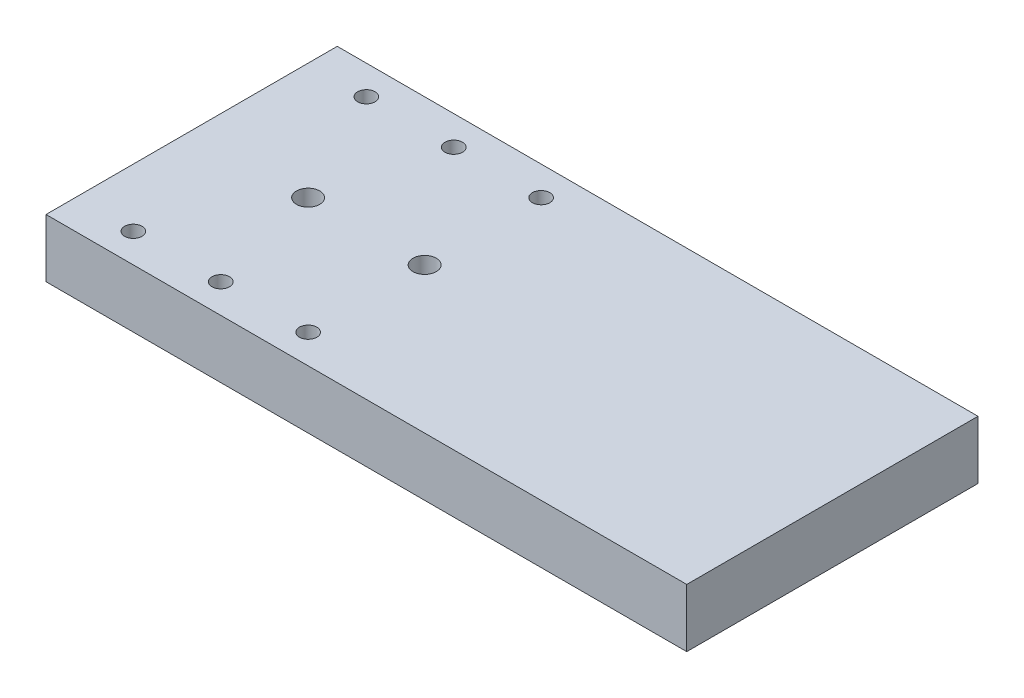
ISO-10303-21;
HEADER;
FILE_DESCRIPTION(('STEP AP214'),'2;1');
FILE_NAME('part.step','',(''),(''),'','','');
FILE_SCHEMA(('AUTOMOTIVE_DESIGN { 1 0 10303 214 1 1 1 1 }'));
ENDSEC;
DATA;
#1=APPLICATION_CONTEXT('core data for automotive mechanical design processes');
#2=APPLICATION_PROTOCOL_DEFINITION('international standard','automotive_design',2000,#1);
#3=PRODUCT_CONTEXT('',#1,'mechanical');
#4=PRODUCT('Part','Part','',(#3));
#5=PRODUCT_RELATED_PRODUCT_CATEGORY('part','',(#4));
#6=PRODUCT_DEFINITION_FORMATION('','',#4);
#7=PRODUCT_DEFINITION_CONTEXT('part definition',#1,'design');
#8=PRODUCT_DEFINITION('design','',#6,#7);
#9=PRODUCT_DEFINITION_SHAPE('','',#8);
#10=(LENGTH_UNIT() NAMED_UNIT(*) SI_UNIT(.MILLI.,.METRE.));
#11=(NAMED_UNIT(*) PLANE_ANGLE_UNIT() SI_UNIT($,.RADIAN.));
#12=(NAMED_UNIT(*) SI_UNIT($,.STERADIAN.) SOLID_ANGLE_UNIT());
#13=UNCERTAINTY_MEASURE_WITH_UNIT(LENGTH_MEASURE(1.E-05),#10,'distance_accuracy_value','');
#14=(GEOMETRIC_REPRESENTATION_CONTEXT(3) GLOBAL_UNCERTAINTY_ASSIGNED_CONTEXT((#13)) GLOBAL_UNIT_ASSIGNED_CONTEXT((#10,
#11,#12)) REPRESENTATION_CONTEXT('',''));
#15=CARTESIAN_POINT('',(0.,0.,0.));
#16=DIRECTION('',(0.,0.,1.));
#17=DIRECTION('',(1.,0.,0.));
#18=AXIS2_PLACEMENT_3D('',#15,#16,#17);
#19=CARTESIAN_POINT('',(0.,20.,0.));
#20=DIRECTION('',(1.,0.,0.));
#21=DIRECTION('',(0.,0.,-1.));
#22=AXIS2_PLACEMENT_3D('',#19,#20,#21);
#23=PLANE('',#22);
#24=DIRECTION('',(0.,0.,1.));
#25=VECTOR('',#24,1.);
#26=CARTESIAN_POINT('',(0.,0.,0.));
#27=LINE('',#26,#25);
#28=CARTESIAN_POINT('',(0.,0.,-100.));
#29=VERTEX_POINT('',#28);
#30=CARTESIAN_POINT('',(0.,0.,0.));
#31=VERTEX_POINT('',#30);
#32=EDGE_CURVE('E97',#29,#31,#27,.T.);
#33=ORIENTED_EDGE('',*,*,#32,.T.);
#34=DIRECTION('',(0.,-1.,0.));
#35=VECTOR('',#34,1.);
#36=CARTESIAN_POINT('',(0.,20.,0.));
#37=LINE('',#36,#35);
#38=CARTESIAN_POINT('',(0.,20.,0.));
#39=VERTEX_POINT('',#38);
#40=EDGE_CURVE('E11',#39,#31,#37,.T.);
#41=ORIENTED_EDGE('',*,*,#40,.F.);
#42=DIRECTION('',(0.,0.,1.));
#43=VECTOR('',#42,1.);
#44=CARTESIAN_POINT('',(0.,20.,0.));
#45=LINE('',#44,#43);
#46=CARTESIAN_POINT('',(0.,20.,-100.));
#47=VERTEX_POINT('',#46);
#48=EDGE_CURVE('E85',#47,#39,#45,.T.);
#49=ORIENTED_EDGE('',*,*,#48,.F.);
#50=DIRECTION('',(0.,-1.,0.));
#51=VECTOR('',#50,1.);
#52=CARTESIAN_POINT('',(0.,20.,-100.));
#53=LINE('',#52,#51);
#54=EDGE_CURVE('E93',#47,#29,#53,.T.);
#55=ORIENTED_EDGE('',*,*,#54,.T.);
#56=EDGE_LOOP('',(#33,#41,#49,#55));
#57=FACE_BOUND('',#56,.T.);
#58=ADVANCED_FACE('F34',(#57),#23,.F.);
#59=CARTESIAN_POINT('',(0.,20.,0.));
#60=DIRECTION('',(0.,0.,-1.));
#61=DIRECTION('',(-1.,0.,0.));
#62=AXIS2_PLACEMENT_3D('',#59,#60,#61);
#63=PLANE('',#62);
#64=DIRECTION('',(1.,0.,0.));
#65=VECTOR('',#64,1.);
#66=CARTESIAN_POINT('',(0.,0.,0.));
#67=LINE('',#66,#65);
#68=CARTESIAN_POINT('',(220.,0.,0.));
#69=VERTEX_POINT('',#68);
#70=EDGE_CURVE('E89',#31,#69,#67,.T.);
#71=ORIENTED_EDGE('',*,*,#70,.T.);
#72=DIRECTION('',(0.,-1.,0.));
#73=VECTOR('',#72,1.);
#74=CARTESIAN_POINT('',(220.,20.,0.));
#75=LINE('',#74,#73);
#76=CARTESIAN_POINT('',(220.,20.,0.));
#77=VERTEX_POINT('',#76);
#78=EDGE_CURVE('E42',#77,#69,#75,.T.);
#79=ORIENTED_EDGE('',*,*,#78,.F.);
#80=DIRECTION('',(1.,0.,0.));
#81=VECTOR('',#80,1.);
#82=CARTESIAN_POINT('',(0.,20.,0.));
#83=LINE('',#82,#81);
#84=EDGE_CURVE('E80',#39,#77,#83,.T.);
#85=ORIENTED_EDGE('',*,*,#84,.F.);
#86=ORIENTED_EDGE('',*,*,#40,.T.);
#87=EDGE_LOOP('',(#71,#79,#85,#86));
#88=FACE_BOUND('',#87,.T.);
#89=ADVANCED_FACE('F88',(#88),#63,.F.);
#90=CARTESIAN_POINT('',(220.,20.,0.));
#91=DIRECTION('',(-1.,0.,0.));
#92=DIRECTION('',(0.,0.,1.));
#93=AXIS2_PLACEMENT_3D('',#90,#91,#92);
#94=PLANE('',#93);
#95=DIRECTION('',(0.,0.,-1.));
#96=VECTOR('',#95,1.);
#97=CARTESIAN_POINT('',(220.,0.,0.));
#98=LINE('',#97,#96);
#99=CARTESIAN_POINT('',(220.,0.,-100.));
#100=VERTEX_POINT('',#99);
#101=EDGE_CURVE('E67',#69,#100,#98,.T.);
#102=ORIENTED_EDGE('',*,*,#101,.T.);
#103=DIRECTION('',(0.,-1.,0.));
#104=VECTOR('',#103,1.);
#105=CARTESIAN_POINT('',(220.,20.,-100.));
#106=LINE('',#105,#104);
#107=CARTESIAN_POINT('',(220.,20.,-100.));
#108=VERTEX_POINT('',#107);
#109=EDGE_CURVE('E90',#108,#100,#106,.T.);
#110=ORIENTED_EDGE('',*,*,#109,.F.);
#111=DIRECTION('',(0.,0.,-1.));
#112=VECTOR('',#111,1.);
#113=CARTESIAN_POINT('',(220.,20.,0.));
#114=LINE('',#113,#112);
#115=EDGE_CURVE('E83',#77,#108,#114,.T.);
#116=ORIENTED_EDGE('',*,*,#115,.F.);
#117=ORIENTED_EDGE('',*,*,#78,.T.);
#118=EDGE_LOOP('',(#102,#110,#116,#117));
#119=FACE_BOUND('',#118,.T.);
#120=ADVANCED_FACE('F91',(#119),#94,.F.);
#121=CARTESIAN_POINT('',(0.,20.,-100.));
#122=DIRECTION('',(0.,0.,1.));
#123=DIRECTION('',(1.,0.,0.));
#124=AXIS2_PLACEMENT_3D('',#121,#122,#123);
#125=PLANE('',#124);
#126=DIRECTION('',(-1.,0.,0.));
#127=VECTOR('',#126,1.);
#128=CARTESIAN_POINT('',(0.,0.,-100.));
#129=LINE('',#128,#127);
#130=EDGE_CURVE('E73',#100,#29,#129,.T.);
#131=ORIENTED_EDGE('',*,*,#130,.T.);
#132=ORIENTED_EDGE('',*,*,#54,.F.);
#133=DIRECTION('',(-1.,0.,0.));
#134=VECTOR('',#133,1.);
#135=CARTESIAN_POINT('',(0.,20.,-100.));
#136=LINE('',#135,#134);
#137=EDGE_CURVE('E50',#108,#47,#136,.T.);
#138=ORIENTED_EDGE('',*,*,#137,.F.);
#139=ORIENTED_EDGE('',*,*,#109,.T.);
#140=EDGE_LOOP('',(#131,#132,#138,#139));
#141=FACE_BOUND('',#140,.T.);
#142=ADVANCED_FACE('F105',(#141),#125,.F.);
#143=CARTESIAN_POINT('',(0.,20.,0.));
#144=DIRECTION('',(0.,-1.,0.));
#145=DIRECTION('',(0.,0.,-1.));
#146=AXIS2_PLACEMENT_3D('',#143,#144,#145);
#147=PLANE('',#146);
#148=CARTESIAN_POINT('',(80.,20.,-10.));
#149=DIRECTION('',(0.,1.,0.));
#150=DIRECTION('',(0.,0.,1.));
#151=AXIS2_PLACEMENT_3D('',#148,#149,#150);
#152=CIRCLE('',#151,3.00000000000001);
#153=CARTESIAN_POINT('',(80.,20.,-6.99999999999999));
#154=VERTEX_POINT('',#153);
#155=EDGE_CURVE('E153',#154,#154,#152,.T.);
#156=ORIENTED_EDGE('',*,*,#155,.F.);
#157=EDGE_LOOP('',(#156));
#158=FACE_BOUND('',#157,.T.);
#159=CARTESIAN_POINT('',(50.,20.,-10.));
#160=DIRECTION('',(0.,1.,0.));
#161=DIRECTION('',(0.,0.,1.));
#162=AXIS2_PLACEMENT_3D('',#159,#160,#161);
#163=CIRCLE('',#162,3.);
#164=CARTESIAN_POINT('',(50.,20.,-7.));
#165=VERTEX_POINT('',#164);
#166=EDGE_CURVE('E147',#165,#165,#163,.T.);
#167=ORIENTED_EDGE('',*,*,#166,.F.);
#168=EDGE_LOOP('',(#167));
#169=FACE_BOUND('',#168,.T.);
#170=CARTESIAN_POINT('',(20.,20.,-10.));
#171=DIRECTION('',(0.,1.,0.));
#172=DIRECTION('',(0.,0.,1.));
#173=AXIS2_PLACEMENT_3D('',#170,#171,#172);
#174=CIRCLE('',#173,3.);
#175=CARTESIAN_POINT('',(20.,20.,-7.));
#176=VERTEX_POINT('',#175);
#177=EDGE_CURVE('E141',#176,#176,#174,.T.);
#178=ORIENTED_EDGE('',*,*,#177,.F.);
#179=EDGE_LOOP('',(#178));
#180=FACE_BOUND('',#179,.T.);
#181=CARTESIAN_POINT('',(80.,20.,-90.));
#182=DIRECTION('',(0.,1.,0.));
#183=DIRECTION('',(0.,0.,1.));
#184=AXIS2_PLACEMENT_3D('',#181,#182,#183);
#185=CIRCLE('',#184,3.00000000000001);
#186=CARTESIAN_POINT('',(80.,20.,-87.));
#187=VERTEX_POINT('',#186);
#188=EDGE_CURVE('E135',#187,#187,#185,.T.);
#189=ORIENTED_EDGE('',*,*,#188,.F.);
#190=EDGE_LOOP('',(#189));
#191=FACE_BOUND('',#190,.T.);
#192=CARTESIAN_POINT('',(50.,20.,-90.));
#193=DIRECTION('',(0.,1.,0.));
#194=DIRECTION('',(0.,0.,1.));
#195=AXIS2_PLACEMENT_3D('',#192,#193,#194);
#196=CIRCLE('',#195,3.);
#197=CARTESIAN_POINT('',(50.,20.,-87.));
#198=VERTEX_POINT('',#197);
#199=EDGE_CURVE('E129',#198,#198,#196,.T.);
#200=ORIENTED_EDGE('',*,*,#199,.F.);
#201=EDGE_LOOP('',(#200));
#202=FACE_BOUND('',#201,.T.);
#203=CARTESIAN_POINT('',(20.,20.,-90.));
#204=DIRECTION('',(0.,1.,0.));
#205=DIRECTION('',(0.,0.,1.));
#206=AXIS2_PLACEMENT_3D('',#203,#204,#205);
#207=CIRCLE('',#206,3.);
#208=CARTESIAN_POINT('',(20.,20.,-87.));
#209=VERTEX_POINT('',#208);
#210=EDGE_CURVE('E123',#209,#209,#207,.T.);
#211=ORIENTED_EDGE('',*,*,#210,.F.);
#212=EDGE_LOOP('',(#211));
#213=FACE_BOUND('',#212,.T.);
#214=CARTESIAN_POINT('',(40.,20.,-50.));
#215=DIRECTION('',(0.,1.,0.));
#216=DIRECTION('',(0.,0.,1.));
#217=AXIS2_PLACEMENT_3D('',#214,#215,#216);
#218=CIRCLE('',#217,4.00000000000001);
#219=CARTESIAN_POINT('',(40.,20.,-46.));
#220=VERTEX_POINT('',#219);
#221=EDGE_CURVE('E114',#220,#220,#218,.T.);
#222=ORIENTED_EDGE('',*,*,#221,.F.);
#223=EDGE_LOOP('',(#222));
#224=FACE_BOUND('',#223,.T.);
#225=CARTESIAN_POINT('',(80.,20.,-50.));
#226=DIRECTION('',(0.,1.,0.));
#227=DIRECTION('',(0.,0.,1.));
#228=AXIS2_PLACEMENT_3D('',#225,#226,#227);
#229=CIRCLE('',#228,3.99999999999999);
#230=CARTESIAN_POINT('',(80.,20.,-46.));
#231=VERTEX_POINT('',#230);
#232=EDGE_CURVE('E111',#231,#231,#229,.T.);
#233=ORIENTED_EDGE('',*,*,#232,.F.);
#234=EDGE_LOOP('',(#233));
#235=FACE_BOUND('',#234,.T.);
#236=ORIENTED_EDGE('',*,*,#48,.T.);
#237=ORIENTED_EDGE('',*,*,#84,.T.);
#238=ORIENTED_EDGE('',*,*,#115,.T.);
#239=ORIENTED_EDGE('',*,*,#137,.T.);
#240=EDGE_LOOP('',(#236,#237,#238,#239));
#241=FACE_BOUND('',#240,.T.);
#242=ADVANCED_FACE('F81',(#158,#169,#180,#191,#202,#213,#224,#235,#241),#147,.F.);
#243=CARTESIAN_POINT('',(0.,0.,0.));
#244=DIRECTION('',(0.,-1.,0.));
#245=DIRECTION('',(0.,0.,-1.));
#246=AXIS2_PLACEMENT_3D('',#243,#244,#245);
#247=PLANE('',#246);
#248=CARTESIAN_POINT('',(80.,0.,-10.));
#249=DIRECTION('',(0.,1.,0.));
#250=DIRECTION('',(0.,0.,1.));
#251=AXIS2_PLACEMENT_3D('',#248,#249,#250);
#252=CIRCLE('',#251,3.00000000000001);
#253=CARTESIAN_POINT('',(80.,0.,-6.99999999999999));
#254=VERTEX_POINT('',#253);
#255=EDGE_CURVE('E150',#254,#254,#252,.T.);
#256=ORIENTED_EDGE('',*,*,#255,.T.);
#257=EDGE_LOOP('',(#256));
#258=FACE_BOUND('',#257,.T.);
#259=CARTESIAN_POINT('',(50.,0.,-10.));
#260=DIRECTION('',(0.,1.,0.));
#261=DIRECTION('',(0.,0.,1.));
#262=AXIS2_PLACEMENT_3D('',#259,#260,#261);
#263=CIRCLE('',#262,3.);
#264=CARTESIAN_POINT('',(50.,0.,-7.));
#265=VERTEX_POINT('',#264);
#266=EDGE_CURVE('E144',#265,#265,#263,.T.);
#267=ORIENTED_EDGE('',*,*,#266,.T.);
#268=EDGE_LOOP('',(#267));
#269=FACE_BOUND('',#268,.T.);
#270=CARTESIAN_POINT('',(20.,0.,-10.));
#271=DIRECTION('',(0.,1.,0.));
#272=DIRECTION('',(0.,0.,1.));
#273=AXIS2_PLACEMENT_3D('',#270,#271,#272);
#274=CIRCLE('',#273,3.);
#275=CARTESIAN_POINT('',(20.,0.,-7.));
#276=VERTEX_POINT('',#275);
#277=EDGE_CURVE('E138',#276,#276,#274,.T.);
#278=ORIENTED_EDGE('',*,*,#277,.T.);
#279=EDGE_LOOP('',(#278));
#280=FACE_BOUND('',#279,.T.);
#281=CARTESIAN_POINT('',(80.,0.,-90.));
#282=DIRECTION('',(0.,1.,0.));
#283=DIRECTION('',(0.,0.,1.));
#284=AXIS2_PLACEMENT_3D('',#281,#282,#283);
#285=CIRCLE('',#284,3.00000000000001);
#286=CARTESIAN_POINT('',(80.,0.,-87.));
#287=VERTEX_POINT('',#286);
#288=EDGE_CURVE('E132',#287,#287,#285,.T.);
#289=ORIENTED_EDGE('',*,*,#288,.T.);
#290=EDGE_LOOP('',(#289));
#291=FACE_BOUND('',#290,.T.);
#292=CARTESIAN_POINT('',(50.,0.,-90.));
#293=DIRECTION('',(0.,1.,0.));
#294=DIRECTION('',(0.,0.,1.));
#295=AXIS2_PLACEMENT_3D('',#292,#293,#294);
#296=CIRCLE('',#295,3.);
#297=CARTESIAN_POINT('',(50.,0.,-87.));
#298=VERTEX_POINT('',#297);
#299=EDGE_CURVE('E126',#298,#298,#296,.T.);
#300=ORIENTED_EDGE('',*,*,#299,.T.);
#301=EDGE_LOOP('',(#300));
#302=FACE_BOUND('',#301,.T.);
#303=CARTESIAN_POINT('',(20.,0.,-90.));
#304=DIRECTION('',(0.,1.,0.));
#305=DIRECTION('',(0.,0.,1.));
#306=AXIS2_PLACEMENT_3D('',#303,#304,#305);
#307=CIRCLE('',#306,3.);
#308=CARTESIAN_POINT('',(20.,0.,-87.));
#309=VERTEX_POINT('',#308);
#310=EDGE_CURVE('E120',#309,#309,#307,.T.);
#311=ORIENTED_EDGE('',*,*,#310,.T.);
#312=EDGE_LOOP('',(#311));
#313=FACE_BOUND('',#312,.T.);
#314=ORIENTED_EDGE('',*,*,#32,.F.);
#315=ORIENTED_EDGE('',*,*,#130,.F.);
#316=ORIENTED_EDGE('',*,*,#101,.F.);
#317=ORIENTED_EDGE('',*,*,#70,.F.);
#318=EDGE_LOOP('',(#314,#315,#316,#317));
#319=FACE_BOUND('',#318,.T.);
#320=ADVANCED_FACE('F108',(#258,#269,#280,#291,#302,#313,#319),#247,.T.);
#321=CARTESIAN_POINT('',(80.,10.,-50.));
#322=DIRECTION('',(0.,1.,0.));
#323=DIRECTION('',(0.,0.,1.));
#324=AXIS2_PLACEMENT_3D('',#321,#322,#323);
#325=CYLINDRICAL_SURFACE('',#324,3.99999999999999);
#326=CARTESIAN_POINT('',(80.,10.,-50.));
#327=DIRECTION('',(0.,1.,0.));
#328=DIRECTION('',(0.,0.,1.));
#329=AXIS2_PLACEMENT_3D('',#326,#327,#328);
#330=CIRCLE('',#329,3.99999999999999);
#331=CARTESIAN_POINT('',(80.,10.,-46.));
#332=VERTEX_POINT('',#331);
#333=EDGE_CURVE('E100',#332,#332,#330,.T.);
#334=ORIENTED_EDGE('',*,*,#333,.F.);
#335=EDGE_LOOP('',(#334));
#336=FACE_BOUND('',#335,.T.);
#337=ORIENTED_EDGE('',*,*,#232,.T.);
#338=EDGE_LOOP('',(#337));
#339=FACE_BOUND('',#338,.T.);
#340=ADVANCED_FACE('F185',(#336,#339),#325,.F.);
#341=CARTESIAN_POINT('',(80.,10.,-50.));
#342=DIRECTION('',(0.,1.,0.));
#343=DIRECTION('',(0.,0.,1.));
#344=AXIS2_PLACEMENT_3D('',#341,#342,#343);
#345=PLANE('',#344);
#346=ORIENTED_EDGE('',*,*,#333,.T.);
#347=EDGE_LOOP('',(#346));
#348=FACE_BOUND('',#347,.T.);
#349=ADVANCED_FACE('F187',(#348),#345,.T.);
#350=CARTESIAN_POINT('',(40.,10.,-50.));
#351=DIRECTION('',(0.,1.,0.));
#352=DIRECTION('',(0.,0.,1.));
#353=AXIS2_PLACEMENT_3D('',#350,#351,#352);
#354=CYLINDRICAL_SURFACE('',#353,4.00000000000001);
#355=CARTESIAN_POINT('',(40.,10.,-50.));
#356=DIRECTION('',(0.,1.,0.));
#357=DIRECTION('',(0.,0.,1.));
#358=AXIS2_PLACEMENT_3D('',#355,#356,#357);
#359=CIRCLE('',#358,4.00000000000001);
#360=CARTESIAN_POINT('',(40.,10.,-46.));
#361=VERTEX_POINT('',#360);
#362=EDGE_CURVE('E117',#361,#361,#359,.T.);
#363=ORIENTED_EDGE('',*,*,#362,.F.);
#364=EDGE_LOOP('',(#363));
#365=FACE_BOUND('',#364,.T.);
#366=ORIENTED_EDGE('',*,*,#221,.T.);
#367=EDGE_LOOP('',(#366));
#368=FACE_BOUND('',#367,.T.);
#369=ADVANCED_FACE('F194',(#365,#368),#354,.F.);
#370=CARTESIAN_POINT('',(40.,10.,-50.));
#371=DIRECTION('',(0.,1.,0.));
#372=DIRECTION('',(0.,0.,1.));
#373=AXIS2_PLACEMENT_3D('',#370,#371,#372);
#374=PLANE('',#373);
#375=ORIENTED_EDGE('',*,*,#362,.T.);
#376=EDGE_LOOP('',(#375));
#377=FACE_BOUND('',#376,.T.);
#378=ADVANCED_FACE('F234',(#377),#374,.T.);
#379=CARTESIAN_POINT('',(20.,0.,-90.));
#380=DIRECTION('',(0.,1.,0.));
#381=DIRECTION('',(0.,0.,1.));
#382=AXIS2_PLACEMENT_3D('',#379,#380,#381);
#383=CYLINDRICAL_SURFACE('',#382,3.);
#384=ORIENTED_EDGE('',*,*,#310,.F.);
#385=EDGE_LOOP('',(#384));
#386=FACE_BOUND('',#385,.T.);
#387=ORIENTED_EDGE('',*,*,#210,.T.);
#388=EDGE_LOOP('',(#387));
#389=FACE_BOUND('',#388,.T.);
#390=ADVANCED_FACE('F228',(#386,#389),#383,.F.);
#391=CARTESIAN_POINT('',(50.,0.,-90.));
#392=DIRECTION('',(0.,1.,0.));
#393=DIRECTION('',(0.,0.,1.));
#394=AXIS2_PLACEMENT_3D('',#391,#392,#393);
#395=CYLINDRICAL_SURFACE('',#394,3.);
#396=ORIENTED_EDGE('',*,*,#299,.F.);
#397=EDGE_LOOP('',(#396));
#398=FACE_BOUND('',#397,.T.);
#399=ORIENTED_EDGE('',*,*,#199,.T.);
#400=EDGE_LOOP('',(#399));
#401=FACE_BOUND('',#400,.T.);
#402=ADVANCED_FACE('F233',(#398,#401),#395,.F.);
#403=CARTESIAN_POINT('',(80.,0.,-90.));
#404=DIRECTION('',(0.,1.,0.));
#405=DIRECTION('',(0.,0.,1.));
#406=AXIS2_PLACEMENT_3D('',#403,#404,#405);
#407=CYLINDRICAL_SURFACE('',#406,3.00000000000001);
#408=ORIENTED_EDGE('',*,*,#288,.F.);
#409=EDGE_LOOP('',(#408));
#410=FACE_BOUND('',#409,.T.);
#411=ORIENTED_EDGE('',*,*,#188,.T.);
#412=EDGE_LOOP('',(#411));
#413=FACE_BOUND('',#412,.T.);
#414=ADVANCED_FACE('F246',(#410,#413),#407,.F.);
#415=CARTESIAN_POINT('',(20.,0.,-10.));
#416=DIRECTION('',(0.,1.,0.));
#417=DIRECTION('',(0.,0.,1.));
#418=AXIS2_PLACEMENT_3D('',#415,#416,#417);
#419=CYLINDRICAL_SURFACE('',#418,3.);
#420=ORIENTED_EDGE('',*,*,#277,.F.);
#421=EDGE_LOOP('',(#420));
#422=FACE_BOUND('',#421,.T.);
#423=ORIENTED_EDGE('',*,*,#177,.T.);
#424=EDGE_LOOP('',(#423));
#425=FACE_BOUND('',#424,.T.);
#426=ADVANCED_FACE('F256',(#422,#425),#419,.F.);
#427=CARTESIAN_POINT('',(50.,0.,-10.));
#428=DIRECTION('',(0.,1.,0.));
#429=DIRECTION('',(0.,0.,1.));
#430=AXIS2_PLACEMENT_3D('',#427,#428,#429);
#431=CYLINDRICAL_SURFACE('',#430,3.);
#432=ORIENTED_EDGE('',*,*,#266,.F.);
#433=EDGE_LOOP('',(#432));
#434=FACE_BOUND('',#433,.T.);
#435=ORIENTED_EDGE('',*,*,#166,.T.);
#436=EDGE_LOOP('',(#435));
#437=FACE_BOUND('',#436,.T.);
#438=ADVANCED_FACE('F164',(#434,#437),#431,.F.);
#439=CARTESIAN_POINT('',(80.,0.,-10.));
#440=DIRECTION('',(0.,1.,0.));
#441=DIRECTION('',(0.,0.,1.));
#442=AXIS2_PLACEMENT_3D('',#439,#440,#441);
#443=CYLINDRICAL_SURFACE('',#442,3.00000000000001);
#444=ORIENTED_EDGE('',*,*,#255,.F.);
#445=EDGE_LOOP('',(#444));
#446=FACE_BOUND('',#445,.T.);
#447=ORIENTED_EDGE('',*,*,#155,.T.);
#448=EDGE_LOOP('',(#447));
#449=FACE_BOUND('',#448,.T.);
#450=ADVANCED_FACE('F161',(#446,#449),#443,.F.);
#451=CLOSED_SHELL('',(#58,#89,#120,#142,#242,#320,#340,#349,#369,#378,#390,#402,#414,#426,#438,#450));
#452=MANIFOLD_SOLID_BREP('B2',#451);
#453=ADVANCED_BREP_SHAPE_REPRESENTATION('',(#18,#452),#14);
#454=SHAPE_DEFINITION_REPRESENTATION(#9,#453);
ENDSEC;
END-ISO-10303-21;
